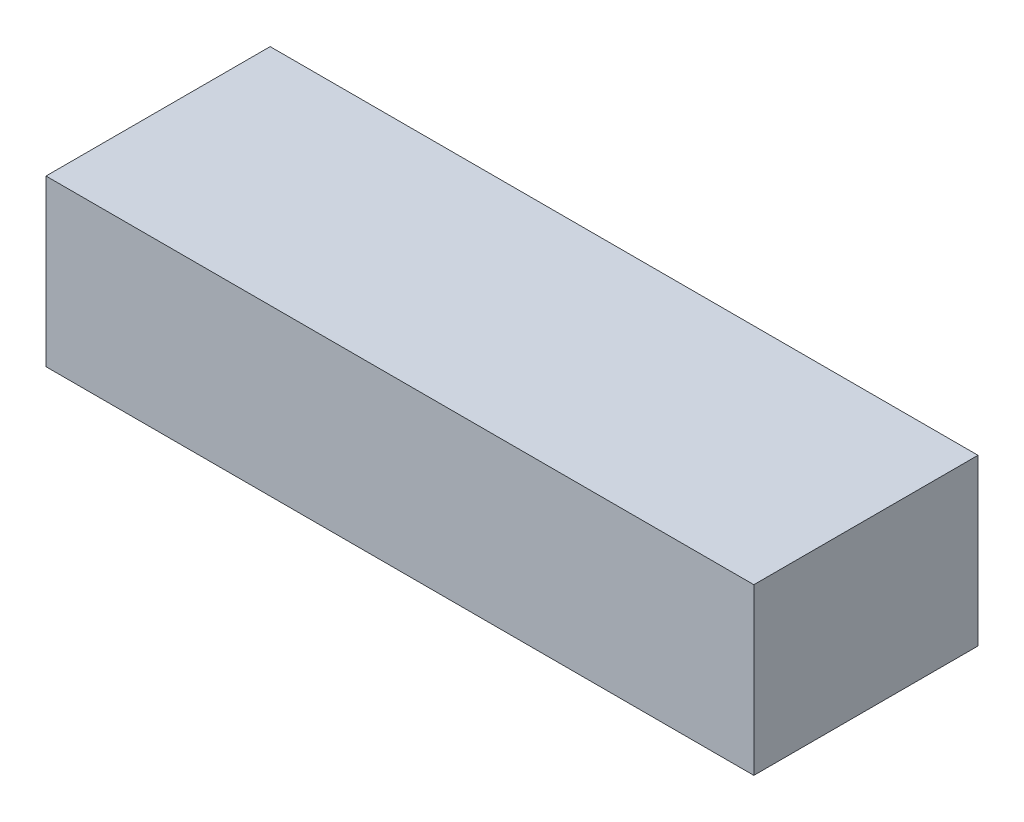
ISO-10303-21;
HEADER;
FILE_DESCRIPTION(('STEP AP214'),'2;1');
FILE_NAME('part.step','',(''),(''),'','','');
FILE_SCHEMA(('AUTOMOTIVE_DESIGN { 1 0 10303 214 1 1 1 1 }'));
ENDSEC;
DATA;
#1=APPLICATION_CONTEXT('core data for automotive mechanical design processes');
#2=APPLICATION_PROTOCOL_DEFINITION('international standard','automotive_design',2000,#1);
#3=PRODUCT_CONTEXT('',#1,'mechanical');
#4=PRODUCT('Part','Part','',(#3));
#5=PRODUCT_RELATED_PRODUCT_CATEGORY('part','',(#4));
#6=PRODUCT_DEFINITION_FORMATION('','',#4);
#7=PRODUCT_DEFINITION_CONTEXT('part definition',#1,'design');
#8=PRODUCT_DEFINITION('design','',#6,#7);
#9=PRODUCT_DEFINITION_SHAPE('','',#8);
#10=(LENGTH_UNIT() NAMED_UNIT(*) SI_UNIT(.MILLI.,.METRE.));
#11=(NAMED_UNIT(*) PLANE_ANGLE_UNIT() SI_UNIT($,.RADIAN.));
#12=(NAMED_UNIT(*) SI_UNIT($,.STERADIAN.) SOLID_ANGLE_UNIT());
#13=UNCERTAINTY_MEASURE_WITH_UNIT(LENGTH_MEASURE(1.E-05),#10,'distance_accuracy_value','');
#14=(GEOMETRIC_REPRESENTATION_CONTEXT(3) GLOBAL_UNCERTAINTY_ASSIGNED_CONTEXT((#13)) GLOBAL_UNIT_ASSIGNED_CONTEXT((#10,
#11,#12)) REPRESENTATION_CONTEXT('',''));
#15=CARTESIAN_POINT('',(0.,0.,0.));
#16=DIRECTION('',(0.,0.,1.));
#17=DIRECTION('',(1.,0.,0.));
#18=AXIS2_PLACEMENT_3D('',#15,#16,#17);
#19=CARTESIAN_POINT('',(0.,14.,0.));
#20=DIRECTION('',(1.,0.,0.));
#21=DIRECTION('',(0.,0.,-1.));
#22=AXIS2_PLACEMENT_3D('',#19,#20,#21);
#23=PLANE('',#22);
#24=DIRECTION('',(0.,0.,1.));
#25=VECTOR('',#24,1.);
#26=CARTESIAN_POINT('',(0.,0.,0.));
#27=LINE('',#26,#25);
#28=CARTESIAN_POINT('',(0.,0.,-19.));
#29=VERTEX_POINT('',#28);
#30=CARTESIAN_POINT('',(0.,0.,0.));
#31=VERTEX_POINT('',#30);
#32=EDGE_CURVE('E96',#29,#31,#27,.T.);
#33=ORIENTED_EDGE('',*,*,#32,.T.);
#34=DIRECTION('',(0.,-1.,0.));
#35=VECTOR('',#34,1.);
#36=CARTESIAN_POINT('',(0.,14.,0.));
#37=LINE('',#36,#35);
#38=CARTESIAN_POINT('',(0.,14.,0.));
#39=VERTEX_POINT('',#38);
#40=EDGE_CURVE('E11',#39,#31,#37,.T.);
#41=ORIENTED_EDGE('',*,*,#40,.F.);
#42=DIRECTION('',(0.,0.,1.));
#43=VECTOR('',#42,1.);
#44=CARTESIAN_POINT('',(0.,14.,0.));
#45=LINE('',#44,#43);
#46=CARTESIAN_POINT('',(0.,14.,-19.));
#47=VERTEX_POINT('',#46);
#48=EDGE_CURVE('E84',#47,#39,#45,.T.);
#49=ORIENTED_EDGE('',*,*,#48,.F.);
#50=DIRECTION('',(0.,-1.,0.));
#51=VECTOR('',#50,1.);
#52=CARTESIAN_POINT('',(0.,14.,-19.));
#53=LINE('',#52,#51);
#54=EDGE_CURVE('E92',#47,#29,#53,.T.);
#55=ORIENTED_EDGE('',*,*,#54,.T.);
#56=EDGE_LOOP('',(#33,#41,#49,#55));
#57=FACE_BOUND('',#56,.T.);
#58=ADVANCED_FACE('F33',(#57),#23,.F.);
#59=CARTESIAN_POINT('',(0.,14.,0.));
#60=DIRECTION('',(0.,0.,-1.));
#61=DIRECTION('',(-1.,0.,0.));
#62=AXIS2_PLACEMENT_3D('',#59,#60,#61);
#63=PLANE('',#62);
#64=DIRECTION('',(1.,0.,0.));
#65=VECTOR('',#64,1.);
#66=CARTESIAN_POINT('',(0.,0.,0.));
#67=LINE('',#66,#65);
#68=CARTESIAN_POINT('',(60.,0.,0.));
#69=VERTEX_POINT('',#68);
#70=EDGE_CURVE('E88',#31,#69,#67,.T.);
#71=ORIENTED_EDGE('',*,*,#70,.T.);
#72=DIRECTION('',(0.,-1.,0.));
#73=VECTOR('',#72,1.);
#74=CARTESIAN_POINT('',(60.,14.,0.));
#75=LINE('',#74,#73);
#76=CARTESIAN_POINT('',(60.,14.,0.));
#77=VERTEX_POINT('',#76);
#78=EDGE_CURVE('E41',#77,#69,#75,.T.);
#79=ORIENTED_EDGE('',*,*,#78,.F.);
#80=DIRECTION('',(1.,0.,0.));
#81=VECTOR('',#80,1.);
#82=CARTESIAN_POINT('',(0.,14.,0.));
#83=LINE('',#82,#81);
#84=EDGE_CURVE('E79',#39,#77,#83,.T.);
#85=ORIENTED_EDGE('',*,*,#84,.F.);
#86=ORIENTED_EDGE('',*,*,#40,.T.);
#87=EDGE_LOOP('',(#71,#79,#85,#86));
#88=FACE_BOUND('',#87,.T.);
#89=ADVANCED_FACE('F87',(#88),#63,.F.);
#90=CARTESIAN_POINT('',(60.,14.,0.));
#91=DIRECTION('',(-1.,0.,0.));
#92=DIRECTION('',(0.,0.,1.));
#93=AXIS2_PLACEMENT_3D('',#90,#91,#92);
#94=PLANE('',#93);
#95=DIRECTION('',(0.,0.,-1.));
#96=VECTOR('',#95,1.);
#97=CARTESIAN_POINT('',(60.,0.,0.));
#98=LINE('',#97,#96);
#99=CARTESIAN_POINT('',(60.,0.,-19.));
#100=VERTEX_POINT('',#99);
#101=EDGE_CURVE('E66',#69,#100,#98,.T.);
#102=ORIENTED_EDGE('',*,*,#101,.T.);
#103=DIRECTION('',(0.,-1.,0.));
#104=VECTOR('',#103,1.);
#105=CARTESIAN_POINT('',(60.,14.,-19.));
#106=LINE('',#105,#104);
#107=CARTESIAN_POINT('',(60.,14.,-19.));
#108=VERTEX_POINT('',#107);
#109=EDGE_CURVE('E89',#108,#100,#106,.T.);
#110=ORIENTED_EDGE('',*,*,#109,.F.);
#111=DIRECTION('',(0.,0.,-1.));
#112=VECTOR('',#111,1.);
#113=CARTESIAN_POINT('',(60.,14.,0.));
#114=LINE('',#113,#112);
#115=EDGE_CURVE('E82',#77,#108,#114,.T.);
#116=ORIENTED_EDGE('',*,*,#115,.F.);
#117=ORIENTED_EDGE('',*,*,#78,.T.);
#118=EDGE_LOOP('',(#102,#110,#116,#117));
#119=FACE_BOUND('',#118,.T.);
#120=ADVANCED_FACE('F90',(#119),#94,.F.);
#121=CARTESIAN_POINT('',(0.,14.,-19.));
#122=DIRECTION('',(0.,0.,1.));
#123=DIRECTION('',(1.,0.,0.));
#124=AXIS2_PLACEMENT_3D('',#121,#122,#123);
#125=PLANE('',#124);
#126=DIRECTION('',(-1.,0.,0.));
#127=VECTOR('',#126,1.);
#128=CARTESIAN_POINT('',(0.,0.,-19.));
#129=LINE('',#128,#127);
#130=EDGE_CURVE('E72',#100,#29,#129,.T.);
#131=ORIENTED_EDGE('',*,*,#130,.T.);
#132=ORIENTED_EDGE('',*,*,#54,.F.);
#133=DIRECTION('',(-1.,0.,0.));
#134=VECTOR('',#133,1.);
#135=CARTESIAN_POINT('',(0.,14.,-19.));
#136=LINE('',#135,#134);
#137=EDGE_CURVE('E49',#108,#47,#136,.T.);
#138=ORIENTED_EDGE('',*,*,#137,.F.);
#139=ORIENTED_EDGE('',*,*,#109,.T.);
#140=EDGE_LOOP('',(#131,#132,#138,#139));
#141=FACE_BOUND('',#140,.T.);
#142=ADVANCED_FACE('F103',(#141),#125,.F.);
#143=CARTESIAN_POINT('',(0.,14.,0.));
#144=DIRECTION('',(0.,-1.,0.));
#145=DIRECTION('',(0.,0.,-1.));
#146=AXIS2_PLACEMENT_3D('',#143,#144,#145);
#147=PLANE('',#146);
#148=ORIENTED_EDGE('',*,*,#48,.T.);
#149=ORIENTED_EDGE('',*,*,#84,.T.);
#150=ORIENTED_EDGE('',*,*,#115,.T.);
#151=ORIENTED_EDGE('',*,*,#137,.T.);
#152=EDGE_LOOP('',(#148,#149,#150,#151));
#153=FACE_BOUND('',#152,.T.);
#154=ADVANCED_FACE('F80',(#153),#147,.F.);
#155=CARTESIAN_POINT('',(0.,0.,0.));
#156=DIRECTION('',(0.,-1.,0.));
#157=DIRECTION('',(0.,0.,-1.));
#158=AXIS2_PLACEMENT_3D('',#155,#156,#157);
#159=PLANE('',#158);
#160=ORIENTED_EDGE('',*,*,#32,.F.);
#161=ORIENTED_EDGE('',*,*,#130,.F.);
#162=ORIENTED_EDGE('',*,*,#101,.F.);
#163=ORIENTED_EDGE('',*,*,#70,.F.);
#164=EDGE_LOOP('',(#160,#161,#162,#163));
#165=FACE_BOUND('',#164,.T.);
#166=ADVANCED_FACE('F106',(#165),#159,.T.);
#167=CLOSED_SHELL('',(#58,#89,#120,#142,#154,#166));
#168=MANIFOLD_SOLID_BREP('B2',#167);
#169=ADVANCED_BREP_SHAPE_REPRESENTATION('',(#18,#168),#14);
#170=SHAPE_DEFINITION_REPRESENTATION(#9,#169);
ENDSEC;
END-ISO-10303-21;
